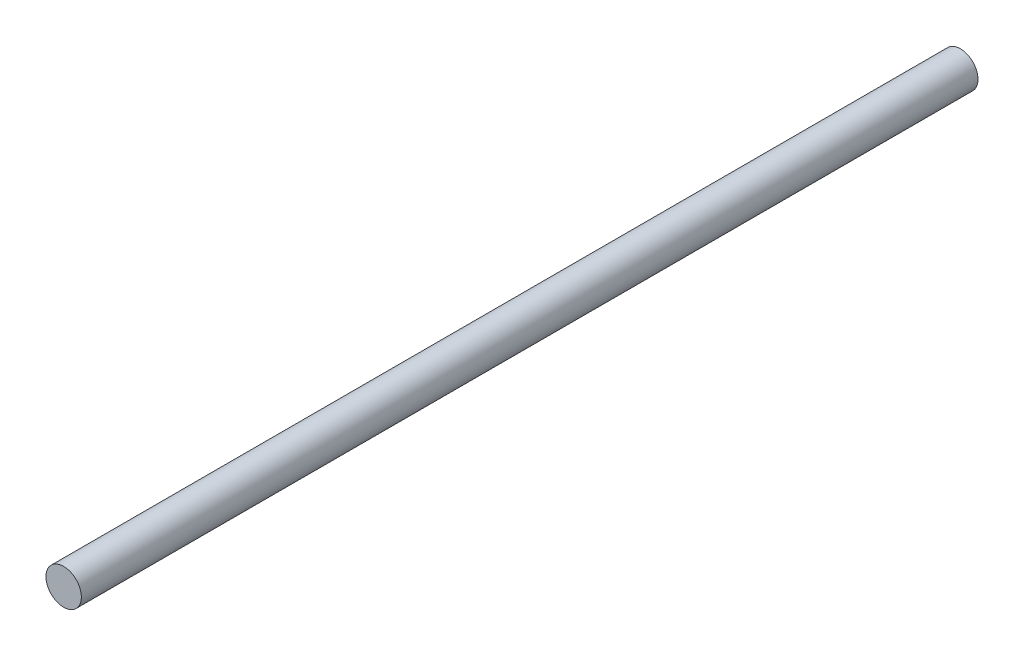
ISO-10303-21;
HEADER;
FILE_DESCRIPTION(('STEP AP214'),'2;1');
FILE_NAME('part.step','',(''),(''),'','','');
FILE_SCHEMA(('AUTOMOTIVE_DESIGN { 1 0 10303 214 1 1 1 1 }'));
ENDSEC;
DATA;
#1=APPLICATION_CONTEXT('core data for automotive mechanical design processes');
#2=APPLICATION_PROTOCOL_DEFINITION('international standard','automotive_design',2000,#1);
#3=PRODUCT_CONTEXT('',#1,'mechanical');
#4=PRODUCT('Part','Part','',(#3));
#5=PRODUCT_RELATED_PRODUCT_CATEGORY('part','',(#4));
#6=PRODUCT_DEFINITION_FORMATION('','',#4);
#7=PRODUCT_DEFINITION_CONTEXT('part definition',#1,'design');
#8=PRODUCT_DEFINITION('design','',#6,#7);
#9=PRODUCT_DEFINITION_SHAPE('','',#8);
#10=(LENGTH_UNIT() NAMED_UNIT(*) SI_UNIT(.MILLI.,.METRE.));
#11=(NAMED_UNIT(*) PLANE_ANGLE_UNIT() SI_UNIT($,.RADIAN.));
#12=(NAMED_UNIT(*) SI_UNIT($,.STERADIAN.) SOLID_ANGLE_UNIT());
#13=UNCERTAINTY_MEASURE_WITH_UNIT(LENGTH_MEASURE(1.E-05),#10,'distance_accuracy_value','');
#14=(GEOMETRIC_REPRESENTATION_CONTEXT(3) GLOBAL_UNCERTAINTY_ASSIGNED_CONTEXT((#13)) GLOBAL_UNIT_ASSIGNED_CONTEXT((#10,
#11,#12)) REPRESENTATION_CONTEXT('',''));
#15=CARTESIAN_POINT('',(0.,0.,0.));
#16=DIRECTION('',(0.,0.,1.));
#17=DIRECTION('',(1.,0.,0.));
#18=AXIS2_PLACEMENT_3D('',#15,#16,#17);
#19=CARTESIAN_POINT('',(0.,0.,76.));
#20=DIRECTION('',(0.,0.,-1.));
#21=DIRECTION('',(-1.,0.,0.));
#22=AXIS2_PLACEMENT_3D('',#19,#20,#21);
#23=CYLINDRICAL_SURFACE('',#22,1.5);
#24=CARTESIAN_POINT('',(0.,0.,76.));
#25=DIRECTION('',(0.,0.,1.));
#26=DIRECTION('',(1.,0.,0.));
#27=AXIS2_PLACEMENT_3D('',#24,#25,#26);
#28=CIRCLE('',#27,1.5);
#29=CARTESIAN_POINT('',(1.5,0.,76.));
#30=VERTEX_POINT('',#29);
#31=EDGE_CURVE('E10',#30,#30,#28,.T.);
#32=ORIENTED_EDGE('',*,*,#31,.F.);
#33=EDGE_LOOP('',(#32));
#34=FACE_BOUND('',#33,.T.);
#35=CARTESIAN_POINT('',(0.,0.,0.));
#36=DIRECTION('',(0.,0.,1.));
#37=DIRECTION('',(1.,0.,0.));
#38=AXIS2_PLACEMENT_3D('',#35,#36,#37);
#39=CIRCLE('',#38,1.5);
#40=CARTESIAN_POINT('',(1.5,0.,0.));
#41=VERTEX_POINT('',#40);
#42=EDGE_CURVE('E37',#41,#41,#39,.T.);
#43=ORIENTED_EDGE('',*,*,#42,.T.);
#44=EDGE_LOOP('',(#43));
#45=FACE_BOUND('',#44,.T.);
#46=ADVANCED_FACE('F34',(#34,#45),#23,.T.);
#47=CARTESIAN_POINT('',(0.,0.,76.));
#48=DIRECTION('',(0.,0.,1.));
#49=DIRECTION('',(1.,0.,0.));
#50=AXIS2_PLACEMENT_3D('',#47,#48,#49);
#51=PLANE('',#50);
#52=ORIENTED_EDGE('',*,*,#31,.T.);
#53=EDGE_LOOP('',(#52));
#54=FACE_BOUND('',#53,.T.);
#55=ADVANCED_FACE('F49',(#54),#51,.T.);
#56=CARTESIAN_POINT('',(0.,0.,0.));
#57=DIRECTION('',(0.,0.,1.));
#58=DIRECTION('',(1.,0.,0.));
#59=AXIS2_PLACEMENT_3D('',#56,#57,#58);
#60=PLANE('',#59);
#61=ORIENTED_EDGE('',*,*,#42,.F.);
#62=EDGE_LOOP('',(#61));
#63=FACE_BOUND('',#62,.T.);
#64=ADVANCED_FACE('F47',(#63),#60,.F.);
#65=CLOSED_SHELL('',(#46,#55,#64));
#66=MANIFOLD_SOLID_BREP('B2',#65);
#67=ADVANCED_BREP_SHAPE_REPRESENTATION('',(#18,#66),#14);
#68=SHAPE_DEFINITION_REPRESENTATION(#9,#67);
ENDSEC;
END-ISO-10303-21;
